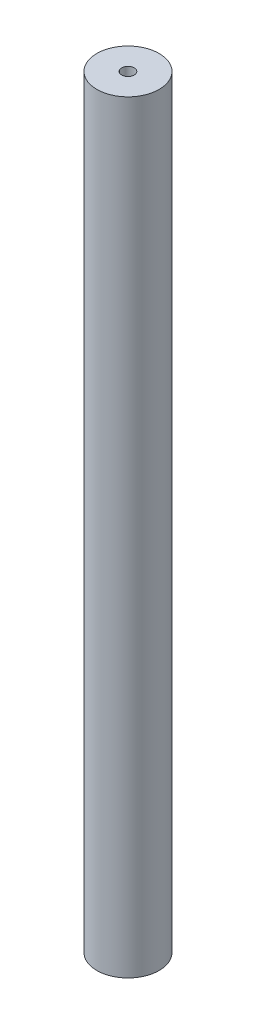
ISO-10303-21;
HEADER;
FILE_DESCRIPTION(('STEP AP214'),'2;1');
FILE_NAME('part.step','',(''),(''),'','','');
FILE_SCHEMA(('AUTOMOTIVE_DESIGN { 1 0 10303 214 1 1 1 1 }'));
ENDSEC;
DATA;
#1=APPLICATION_CONTEXT('core data for automotive mechanical design processes');
#2=APPLICATION_PROTOCOL_DEFINITION('international standard','automotive_design',2000,#1);
#3=PRODUCT_CONTEXT('',#1,'mechanical');
#4=PRODUCT('Part','Part','',(#3));
#5=PRODUCT_RELATED_PRODUCT_CATEGORY('part','',(#4));
#6=PRODUCT_DEFINITION_FORMATION('','',#4);
#7=PRODUCT_DEFINITION_CONTEXT('part definition',#1,'design');
#8=PRODUCT_DEFINITION('design','',#6,#7);
#9=PRODUCT_DEFINITION_SHAPE('','',#8);
#10=(LENGTH_UNIT() NAMED_UNIT(*) SI_UNIT(.MILLI.,.METRE.));
#11=(NAMED_UNIT(*) PLANE_ANGLE_UNIT() SI_UNIT($,.RADIAN.));
#12=(NAMED_UNIT(*) SI_UNIT($,.STERADIAN.) SOLID_ANGLE_UNIT());
#13=UNCERTAINTY_MEASURE_WITH_UNIT(LENGTH_MEASURE(1.E-05),#10,'distance_accuracy_value','');
#14=(GEOMETRIC_REPRESENTATION_CONTEXT(3) GLOBAL_UNCERTAINTY_ASSIGNED_CONTEXT((#13)) GLOBAL_UNIT_ASSIGNED_CONTEXT((#10,
#11,#12)) REPRESENTATION_CONTEXT('',''));
#15=CARTESIAN_POINT('',(0.,0.,0.));
#16=DIRECTION('',(0.,0.,1.));
#17=DIRECTION('',(1.,0.,0.));
#18=AXIS2_PLACEMENT_3D('',#15,#16,#17);
#19=CARTESIAN_POINT('',(0.,155.575,0.));
#20=DIRECTION('',(0.,-1.,0.));
#21=DIRECTION('',(0.,0.,-1.));
#22=AXIS2_PLACEMENT_3D('',#19,#20,#21);
#23=CYLINDRICAL_SURFACE('',#22,12.7);
#24=CARTESIAN_POINT('',(0.,155.575,0.));
#25=DIRECTION('',(0.,1.,0.));
#26=DIRECTION('',(0.,0.,1.));
#27=AXIS2_PLACEMENT_3D('',#24,#25,#26);
#28=CIRCLE('',#27,12.7);
#29=CARTESIAN_POINT('',(0.,155.575,12.7));
#30=VERTEX_POINT('',#29);
#31=EDGE_CURVE('E11',#30,#30,#28,.T.);
#32=ORIENTED_EDGE('',*,*,#31,.F.);
#33=EDGE_LOOP('',(#32));
#34=FACE_BOUND('',#33,.T.);
#35=CARTESIAN_POINT('',(0.,-155.575,0.));
#36=DIRECTION('',(0.,1.,0.));
#37=DIRECTION('',(0.,0.,1.));
#38=AXIS2_PLACEMENT_3D('',#35,#36,#37);
#39=CIRCLE('',#38,12.7);
#40=CARTESIAN_POINT('',(0.,-155.575,12.7));
#41=VERTEX_POINT('',#40);
#42=EDGE_CURVE('E44',#41,#41,#39,.T.);
#43=ORIENTED_EDGE('',*,*,#42,.T.);
#44=EDGE_LOOP('',(#43));
#45=FACE_BOUND('',#44,.T.);
#46=ADVANCED_FACE('F41',(#34,#45),#23,.T.);
#47=CARTESIAN_POINT('',(0.,155.575,0.));
#48=DIRECTION('',(0.,1.,0.));
#49=DIRECTION('',(0.,0.,1.));
#50=AXIS2_PLACEMENT_3D('',#47,#48,#49);
#51=PLANE('',#50);
#52=CARTESIAN_POINT('',(0.,155.575,0.));
#53=DIRECTION('',(0.,1.,0.));
#54=DIRECTION('',(0.,0.,1.));
#55=AXIS2_PLACEMENT_3D('',#52,#53,#54);
#56=CIRCLE('',#55,2.55269999999999);
#57=CARTESIAN_POINT('',(0.,155.575,2.55269999999999));
#58=VERTEX_POINT('',#57);
#59=EDGE_CURVE('E65',#58,#58,#56,.T.);
#60=ORIENTED_EDGE('',*,*,#59,.F.);
#61=EDGE_LOOP('',(#60));
#62=FACE_BOUND('',#61,.T.);
#63=ORIENTED_EDGE('',*,*,#31,.T.);
#64=EDGE_LOOP('',(#63));
#65=FACE_BOUND('',#64,.T.);
#66=ADVANCED_FACE('F83',(#62,#65),#51,.T.);
#67=CARTESIAN_POINT('',(0.,-155.575,0.));
#68=DIRECTION('',(0.,1.,0.));
#69=DIRECTION('',(0.,0.,1.));
#70=AXIS2_PLACEMENT_3D('',#67,#68,#69);
#71=PLANE('',#70);
#72=CARTESIAN_POINT('',(0.,-155.575,0.));
#73=DIRECTION('',(0.,-1.,0.));
#74=DIRECTION('',(0.,0.,-1.));
#75=AXIS2_PLACEMENT_3D('',#72,#73,#74);
#76=CIRCLE('',#75,2.55269999999999);
#77=CARTESIAN_POINT('',(0.,-155.575,-2.55269999999999));
#78=VERTEX_POINT('',#77);
#79=EDGE_CURVE('E64',#78,#78,#76,.T.);
#80=ORIENTED_EDGE('',*,*,#79,.F.);
#81=EDGE_LOOP('',(#80));
#82=FACE_BOUND('',#81,.T.);
#83=ORIENTED_EDGE('',*,*,#42,.F.);
#84=EDGE_LOOP('',(#83));
#85=FACE_BOUND('',#84,.T.);
#86=ADVANCED_FACE('F80',(#82,#85),#71,.F.);
#87=CARTESIAN_POINT('',(0.,-139.065,0.));
#88=DIRECTION('',(0.,-1.,0.));
#89=DIRECTION('',(0.,0.,-1.));
#90=AXIS2_PLACEMENT_3D('',#87,#88,#89);
#91=CONICAL_SURFACE('',#90,2.55269999999999,1.02974425867665);
#92=CARTESIAN_POINT('',(0.,-137.531183097808,0.));
#93=VERTEX_POINT('',#92);
#94=VERTEX_LOOP('',#93);
#95=FACE_BOUND('',#94,.T.);
#96=CARTESIAN_POINT('',(0.,-139.065,0.));
#97=DIRECTION('',(0.,-1.,0.));
#98=DIRECTION('',(0.,0.,-1.));
#99=AXIS2_PLACEMENT_3D('',#96,#97,#98);
#100=CIRCLE('',#99,2.55269999999999);
#101=CARTESIAN_POINT('',(0.,-139.065,-2.55269999999999));
#102=VERTEX_POINT('',#101);
#103=EDGE_CURVE('E68',#102,#102,#100,.T.);
#104=ORIENTED_EDGE('',*,*,#103,.T.);
#105=EDGE_LOOP('',(#104));
#106=FACE_BOUND('',#105,.T.);
#107=ADVANCED_FACE('F82',(#95,#106),#91,.F.);
#108=CARTESIAN_POINT('',(0.,-155.575,0.));
#109=DIRECTION('',(0.,-1.,0.));
#110=DIRECTION('',(0.,0.,-1.));
#111=AXIS2_PLACEMENT_3D('',#108,#109,#110);
#112=CYLINDRICAL_SURFACE('',#111,2.55269999999999);
#113=ORIENTED_EDGE('',*,*,#103,.F.);
#114=EDGE_LOOP('',(#113));
#115=FACE_BOUND('',#114,.T.);
#116=ORIENTED_EDGE('',*,*,#79,.T.);
#117=EDGE_LOOP('',(#116));
#118=FACE_BOUND('',#117,.T.);
#119=ADVANCED_FACE('F58',(#115,#118),#112,.F.);
#120=CARTESIAN_POINT('',(0.,139.065,0.));
#121=DIRECTION('',(0.,1.,0.));
#122=DIRECTION('',(0.,0.,1.));
#123=AXIS2_PLACEMENT_3D('',#120,#121,#122);
#124=CONICAL_SURFACE('',#123,2.55269999999999,1.02974425867665);
#125=CARTESIAN_POINT('',(0.,137.531183097808,0.));
#126=VERTEX_POINT('',#125);
#127=VERTEX_LOOP('',#126);
#128=FACE_BOUND('',#127,.T.);
#129=CARTESIAN_POINT('',(0.,139.065,0.));
#130=DIRECTION('',(0.,1.,0.));
#131=DIRECTION('',(0.,0.,1.));
#132=AXIS2_PLACEMENT_3D('',#129,#130,#131);
#133=CIRCLE('',#132,2.55269999999999);
#134=CARTESIAN_POINT('',(0.,139.065,2.55269999999999));
#135=VERTEX_POINT('',#134);
#136=EDGE_CURVE('E62',#135,#135,#133,.T.);
#137=ORIENTED_EDGE('',*,*,#136,.T.);
#138=EDGE_LOOP('',(#137));
#139=FACE_BOUND('',#138,.T.);
#140=ADVANCED_FACE('F54',(#128,#139),#124,.F.);
#141=CARTESIAN_POINT('',(0.,155.575,0.));
#142=DIRECTION('',(0.,1.,0.));
#143=DIRECTION('',(0.,0.,1.));
#144=AXIS2_PLACEMENT_3D('',#141,#142,#143);
#145=CYLINDRICAL_SURFACE('',#144,2.55269999999999);
#146=ORIENTED_EDGE('',*,*,#136,.F.);
#147=EDGE_LOOP('',(#146));
#148=FACE_BOUND('',#147,.T.);
#149=ORIENTED_EDGE('',*,*,#59,.T.);
#150=EDGE_LOOP('',(#149));
#151=FACE_BOUND('',#150,.T.);
#152=ADVANCED_FACE('F57',(#148,#151),#145,.F.);
#153=CLOSED_SHELL('',(#46,#66,#86,#107,#119,#140,#152));
#154=MANIFOLD_SOLID_BREP('B2',#153);
#155=ADVANCED_BREP_SHAPE_REPRESENTATION('',(#18,#154),#14);
#156=SHAPE_DEFINITION_REPRESENTATION(#9,#155);
ENDSEC;
END-ISO-10303-21;
